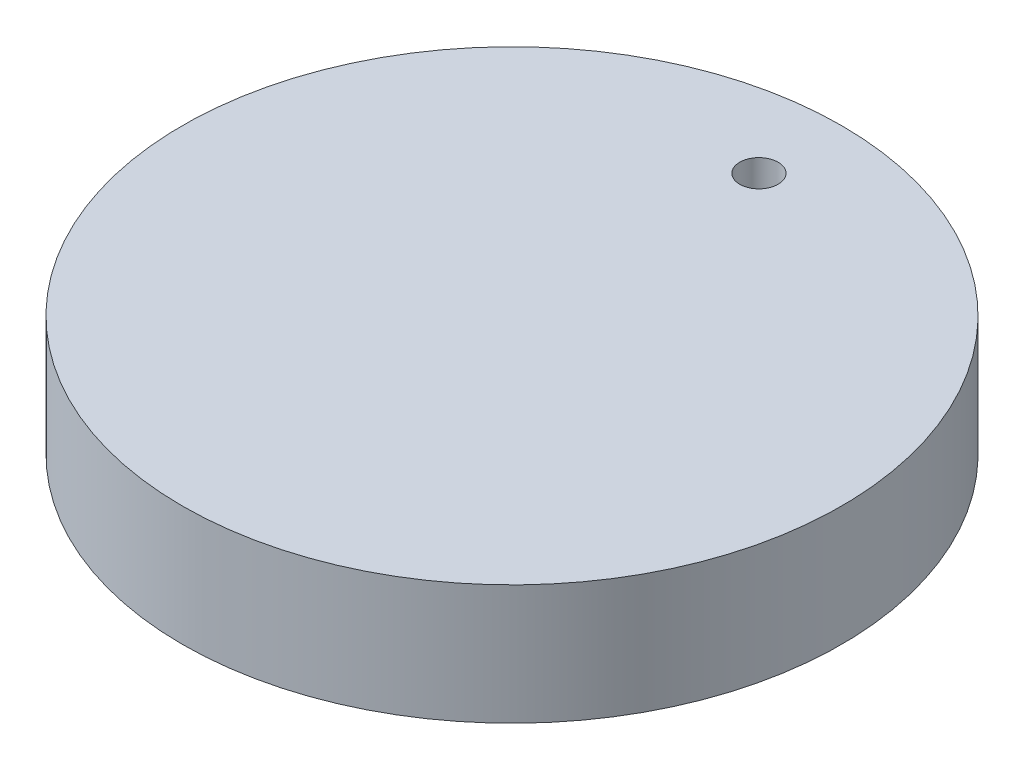
ISO-10303-21;
HEADER;
FILE_DESCRIPTION(('STEP AP214'),'2;1');
FILE_NAME('part.step','',(''),(''),'','','');
FILE_SCHEMA(('AUTOMOTIVE_DESIGN { 1 0 10303 214 1 1 1 1 }'));
ENDSEC;
DATA;
#1=APPLICATION_CONTEXT('core data for automotive mechanical design processes');
#2=APPLICATION_PROTOCOL_DEFINITION('international standard','automotive_design',2000,#1);
#3=PRODUCT_CONTEXT('',#1,'mechanical');
#4=PRODUCT('Part','Part','',(#3));
#5=PRODUCT_RELATED_PRODUCT_CATEGORY('part','',(#4));
#6=PRODUCT_DEFINITION_FORMATION('','',#4);
#7=PRODUCT_DEFINITION_CONTEXT('part definition',#1,'design');
#8=PRODUCT_DEFINITION('design','',#6,#7);
#9=PRODUCT_DEFINITION_SHAPE('','',#8);
#10=(LENGTH_UNIT() NAMED_UNIT(*) SI_UNIT(.MILLI.,.METRE.));
#11=(NAMED_UNIT(*) PLANE_ANGLE_UNIT() SI_UNIT($,.RADIAN.));
#12=(NAMED_UNIT(*) SI_UNIT($,.STERADIAN.) SOLID_ANGLE_UNIT());
#13=UNCERTAINTY_MEASURE_WITH_UNIT(LENGTH_MEASURE(1.E-05),#10,'distance_accuracy_value','');
#14=(GEOMETRIC_REPRESENTATION_CONTEXT(3) GLOBAL_UNCERTAINTY_ASSIGNED_CONTEXT((#13)) GLOBAL_UNIT_ASSIGNED_CONTEXT((#10,
#11,#12)) REPRESENTATION_CONTEXT('',''));
#15=CARTESIAN_POINT('',(0.,0.,0.));
#16=DIRECTION('',(0.,0.,1.));
#17=DIRECTION('',(1.,0.,0.));
#18=AXIS2_PLACEMENT_3D('',#15,#16,#17);
#19=CARTESIAN_POINT('',(0.,20.,0.));
#20=DIRECTION('',(0.,1.,0.));
#21=DIRECTION('',(0.,0.,1.));
#22=AXIS2_PLACEMENT_3D('',#19,#20,#21);
#23=PLANE('',#22);
#24=CARTESIAN_POINT('',(0.,20.,0.));
#25=DIRECTION('',(0.,1.,0.));
#26=DIRECTION('',(0.,0.,1.));
#27=AXIS2_PLACEMENT_3D('',#24,#25,#26);
#28=CIRCLE('',#27,55.);
#29=CARTESIAN_POINT('',(0.,20.,55.));
#30=VERTEX_POINT('',#29);
#31=EDGE_CURVE('E10',#30,#30,#28,.T.);
#32=ORIENTED_EDGE('',*,*,#31,.T.);
#33=EDGE_LOOP('',(#32));
#34=FACE_BOUND('',#33,.T.);
#35=CARTESIAN_POINT('',(0.,20.,-41.2108385026355));
#36=DIRECTION('',(0.,1.,0.));
#37=DIRECTION('',(0.,0.,1.));
#38=AXIS2_PLACEMENT_3D('',#35,#36,#37);
#39=CIRCLE('',#38,3.2);
#40=CARTESIAN_POINT('',(0.,20.,-38.0108385026355));
#41=VERTEX_POINT('',#40);
#42=EDGE_CURVE('E46',#41,#41,#39,.T.);
#43=ORIENTED_EDGE('',*,*,#42,.F.);
#44=EDGE_LOOP('',(#43));
#45=FACE_BOUND('',#44,.T.);
#46=ADVANCED_FACE('F35',(#34,#45),#23,.T.);
#47=CARTESIAN_POINT('',(0.,0.,0.));
#48=DIRECTION('',(0.,1.,0.));
#49=DIRECTION('',(0.,0.,1.));
#50=AXIS2_PLACEMENT_3D('',#47,#48,#49);
#51=PLANE('',#50);
#52=CARTESIAN_POINT('',(0.,0.,0.));
#53=DIRECTION('',(0.,1.,0.));
#54=DIRECTION('',(0.,0.,1.));
#55=AXIS2_PLACEMENT_3D('',#52,#53,#54);
#56=CIRCLE('',#55,55.);
#57=CARTESIAN_POINT('',(0.,0.,55.));
#58=VERTEX_POINT('',#57);
#59=EDGE_CURVE('E39',#58,#58,#56,.T.);
#60=ORIENTED_EDGE('',*,*,#59,.F.);
#61=EDGE_LOOP('',(#60));
#62=FACE_BOUND('',#61,.T.);
#63=CARTESIAN_POINT('',(0.,0.,-41.2108385026355));
#64=DIRECTION('',(0.,1.,0.));
#65=DIRECTION('',(0.,0.,1.));
#66=AXIS2_PLACEMENT_3D('',#63,#64,#65);
#67=CIRCLE('',#66,3.2);
#68=CARTESIAN_POINT('',(0.,0.,-38.0108385026355));
#69=VERTEX_POINT('',#68);
#70=EDGE_CURVE('E48',#69,#69,#67,.T.);
#71=ORIENTED_EDGE('',*,*,#70,.T.);
#72=EDGE_LOOP('',(#71));
#73=FACE_BOUND('',#72,.T.);
#74=ADVANCED_FACE('F58',(#62,#73),#51,.F.);
#75=CARTESIAN_POINT('',(0.,20.,0.));
#76=DIRECTION('',(0.,-1.,0.));
#77=DIRECTION('',(0.,0.,-1.));
#78=AXIS2_PLACEMENT_3D('',#75,#76,#77);
#79=CYLINDRICAL_SURFACE('',#78,55.);
#80=ORIENTED_EDGE('',*,*,#31,.F.);
#81=EDGE_LOOP('',(#80));
#82=FACE_BOUND('',#81,.T.);
#83=ORIENTED_EDGE('',*,*,#59,.T.);
#84=EDGE_LOOP('',(#83));
#85=FACE_BOUND('',#84,.T.);
#86=ADVANCED_FACE('F37',(#82,#85),#79,.T.);
#87=CARTESIAN_POINT('',(0.,20.,-41.2108385026355));
#88=DIRECTION('',(0.,-1.,0.));
#89=DIRECTION('',(0.,0.,-1.));
#90=AXIS2_PLACEMENT_3D('',#87,#88,#89);
#91=CYLINDRICAL_SURFACE('',#90,3.2);
#92=ORIENTED_EDGE('',*,*,#42,.T.);
#93=EDGE_LOOP('',(#92));
#94=FACE_BOUND('',#93,.T.);
#95=ORIENTED_EDGE('',*,*,#70,.F.);
#96=EDGE_LOOP('',(#95));
#97=FACE_BOUND('',#96,.T.);
#98=ADVANCED_FACE('F54',(#94,#97),#91,.F.);
#99=CLOSED_SHELL('',(#46,#74,#86,#98));
#100=MANIFOLD_SOLID_BREP('B2',#99);
#101=ADVANCED_BREP_SHAPE_REPRESENTATION('',(#18,#100),#14);
#102=SHAPE_DEFINITION_REPRESENTATION(#9,#101);
ENDSEC;
END-ISO-10303-21;
